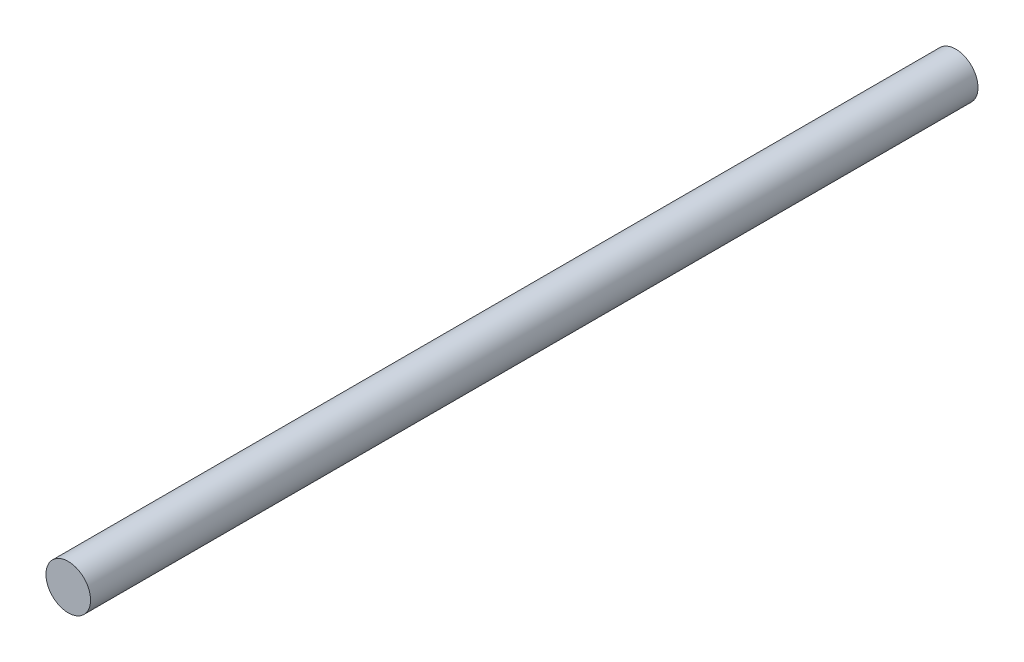
ISO-10303-21;
HEADER;
FILE_DESCRIPTION(('STEP AP214'),'2;1');
FILE_NAME('part.step','',(''),(''),'','','');
FILE_SCHEMA(('AUTOMOTIVE_DESIGN { 1 0 10303 214 1 1 1 1 }'));
ENDSEC;
DATA;
#1=APPLICATION_CONTEXT('core data for automotive mechanical design processes');
#2=APPLICATION_PROTOCOL_DEFINITION('international standard','automotive_design',2000,#1);
#3=PRODUCT_CONTEXT('',#1,'mechanical');
#4=PRODUCT('Part','Part','',(#3));
#5=PRODUCT_RELATED_PRODUCT_CATEGORY('part','',(#4));
#6=PRODUCT_DEFINITION_FORMATION('','',#4);
#7=PRODUCT_DEFINITION_CONTEXT('part definition',#1,'design');
#8=PRODUCT_DEFINITION('design','',#6,#7);
#9=PRODUCT_DEFINITION_SHAPE('','',#8);
#10=(LENGTH_UNIT() NAMED_UNIT(*) SI_UNIT(.MILLI.,.METRE.));
#11=(NAMED_UNIT(*) PLANE_ANGLE_UNIT() SI_UNIT($,.RADIAN.));
#12=(NAMED_UNIT(*) SI_UNIT($,.STERADIAN.) SOLID_ANGLE_UNIT());
#13=UNCERTAINTY_MEASURE_WITH_UNIT(LENGTH_MEASURE(1.E-05),#10,'distance_accuracy_value','');
#14=(GEOMETRIC_REPRESENTATION_CONTEXT(3) GLOBAL_UNCERTAINTY_ASSIGNED_CONTEXT((#13)) GLOBAL_UNIT_ASSIGNED_CONTEXT((#10,
#11,#12)) REPRESENTATION_CONTEXT('',''));
#15=CARTESIAN_POINT('',(0.,0.,0.));
#16=DIRECTION('',(0.,0.,1.));
#17=DIRECTION('',(1.,0.,0.));
#18=AXIS2_PLACEMENT_3D('',#15,#16,#17);
#19=CARTESIAN_POINT('',(0.,0.,39.8018));
#20=DIRECTION('',(0.,0.,-1.));
#21=DIRECTION('',(-1.,0.,0.));
#22=AXIS2_PLACEMENT_3D('',#19,#20,#21);
#23=CYLINDRICAL_SURFACE('',#22,1.);
#24=CARTESIAN_POINT('',(0.,0.,39.8018));
#25=DIRECTION('',(0.,0.,1.));
#26=DIRECTION('',(1.,0.,0.));
#27=AXIS2_PLACEMENT_3D('',#24,#25,#26);
#28=CIRCLE('',#27,1.);
#29=CARTESIAN_POINT('',(1.,0.,39.8018));
#30=VERTEX_POINT('',#29);
#31=EDGE_CURVE('E10',#30,#30,#28,.T.);
#32=ORIENTED_EDGE('',*,*,#31,.F.);
#33=EDGE_LOOP('',(#32));
#34=FACE_BOUND('',#33,.T.);
#35=CARTESIAN_POINT('',(0.,0.,0.));
#36=DIRECTION('',(0.,0.,1.));
#37=DIRECTION('',(1.,0.,0.));
#38=AXIS2_PLACEMENT_3D('',#35,#36,#37);
#39=CIRCLE('',#38,1.);
#40=CARTESIAN_POINT('',(1.,0.,0.));
#41=VERTEX_POINT('',#40);
#42=EDGE_CURVE('E40',#41,#41,#39,.T.);
#43=ORIENTED_EDGE('',*,*,#42,.T.);
#44=EDGE_LOOP('',(#43));
#45=FACE_BOUND('',#44,.T.);
#46=ADVANCED_FACE('F37',(#34,#45),#23,.T.);
#47=CARTESIAN_POINT('',(0.,0.,39.8018));
#48=DIRECTION('',(0.,0.,1.));
#49=DIRECTION('',(1.,0.,0.));
#50=AXIS2_PLACEMENT_3D('',#47,#48,#49);
#51=PLANE('',#50);
#52=ORIENTED_EDGE('',*,*,#31,.T.);
#53=EDGE_LOOP('',(#52));
#54=FACE_BOUND('',#53,.T.);
#55=ADVANCED_FACE('F52',(#54),#51,.T.);
#56=CARTESIAN_POINT('',(0.,0.,0.));
#57=DIRECTION('',(0.,0.,1.));
#58=DIRECTION('',(1.,0.,0.));
#59=AXIS2_PLACEMENT_3D('',#56,#57,#58);
#60=PLANE('',#59);
#61=ORIENTED_EDGE('',*,*,#42,.F.);
#62=EDGE_LOOP('',(#61));
#63=FACE_BOUND('',#62,.T.);
#64=ADVANCED_FACE('F50',(#63),#60,.F.);
#65=CLOSED_SHELL('',(#46,#55,#64));
#66=MANIFOLD_SOLID_BREP('B2',#65);
#67=ADVANCED_BREP_SHAPE_REPRESENTATION('',(#18,#66),#14);
#68=SHAPE_DEFINITION_REPRESENTATION(#9,#67);
ENDSEC;
END-ISO-10303-21;
